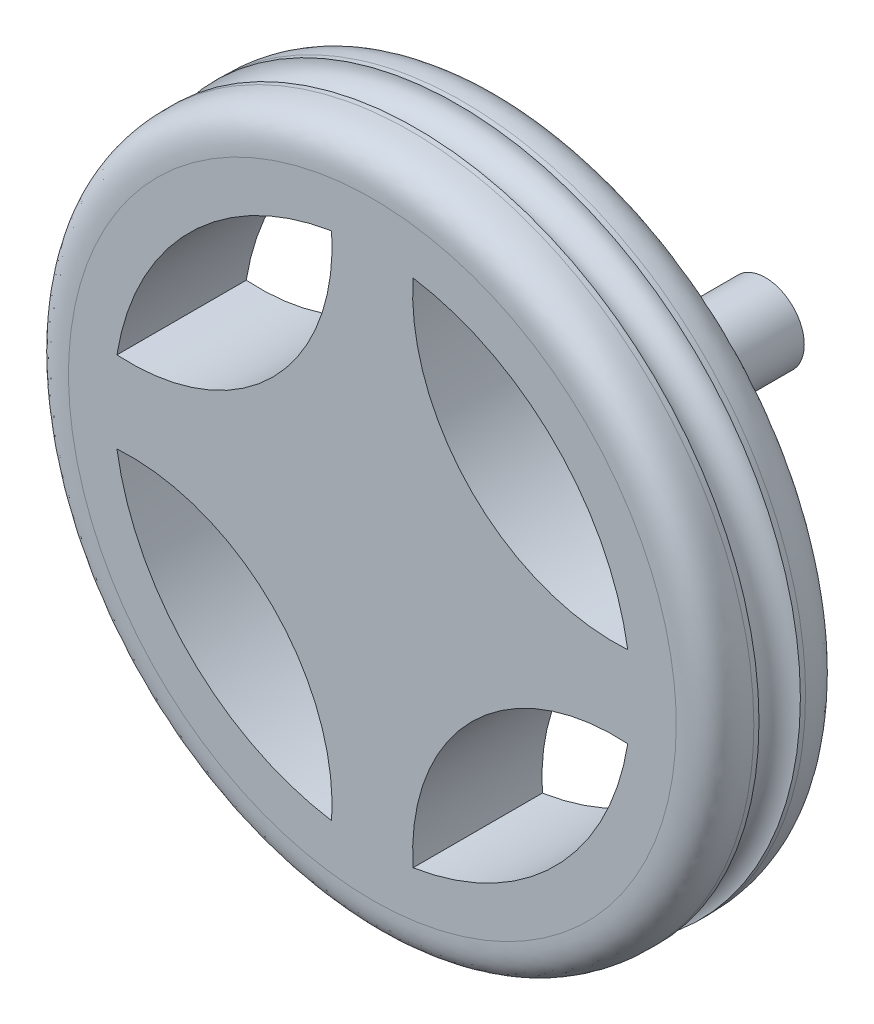
ISO-10303-21;
HEADER;
FILE_DESCRIPTION(('STEP AP214'),'2;1');
FILE_NAME('part.step','',(''),(''),'','','');
FILE_SCHEMA(('AUTOMOTIVE_DESIGN { 1 0 10303 214 1 1 1 1 }'));
ENDSEC;
DATA;
#1=APPLICATION_CONTEXT('core data for automotive mechanical design processes');
#2=APPLICATION_PROTOCOL_DEFINITION('international standard','automotive_design',2000,#1);
#3=PRODUCT_CONTEXT('',#1,'mechanical');
#4=PRODUCT('Part','Part','',(#3));
#5=PRODUCT_RELATED_PRODUCT_CATEGORY('part','',(#4));
#6=PRODUCT_DEFINITION_FORMATION('','',#4);
#7=PRODUCT_DEFINITION_CONTEXT('part definition',#1,'design');
#8=PRODUCT_DEFINITION('design','',#6,#7);
#9=PRODUCT_DEFINITION_SHAPE('','',#8);
#10=(LENGTH_UNIT() NAMED_UNIT(*) SI_UNIT(.MILLI.,.METRE.));
#11=(NAMED_UNIT(*) PLANE_ANGLE_UNIT() SI_UNIT($,.RADIAN.));
#12=(NAMED_UNIT(*) SI_UNIT($,.STERADIAN.) SOLID_ANGLE_UNIT());
#13=UNCERTAINTY_MEASURE_WITH_UNIT(LENGTH_MEASURE(1.E-05),#10,'distance_accuracy_value','');
#14=(GEOMETRIC_REPRESENTATION_CONTEXT(3) GLOBAL_UNCERTAINTY_ASSIGNED_CONTEXT((#13)) GLOBAL_UNIT_ASSIGNED_CONTEXT((#10,
#11,#12)) REPRESENTATION_CONTEXT('',''));
#15=CARTESIAN_POINT('',(0.,0.,0.));
#16=DIRECTION('',(0.,0.,1.));
#17=DIRECTION('',(1.,0.,0.));
#18=AXIS2_PLACEMENT_3D('',#15,#16,#17);
#19=CARTESIAN_POINT('',(4.49639746502567,34.7438056757314,20.));
#20=DIRECTION('',(0.,0.,-1.));
#21=DIRECTION('',(-1.,0.,0.));
#22=AXIS2_PLACEMENT_3D('',#19,#20,#21);
#23=CYLINDRICAL_SURFACE('',#22,26.5);
#24=CARTESIAN_POINT('',(30.9963974650257,34.7438056757314,17.));
#25=CARTESIAN_POINT('',(30.9963974650257,38.2121807728972,17.));
#26=CARTESIAN_POINT('',(29.6165920619499,45.1489309672287,17.));
#27=CARTESIAN_POINT('',(23.7225620450856,53.9699702557912,17.));
#28=CARTESIAN_POINT('',(14.9015227565231,59.8640002726556,17.));
#29=CARTESIAN_POINT('',(4.49639746502556,61.9337083772693,17.));
#30=CARTESIAN_POINT('',(-5.9087278264716,59.8640002726556,17.));
#31=CARTESIAN_POINT('',(-14.7297671150342,53.9699702557913,17.));
#32=CARTESIAN_POINT('',(-20.6237971318985,45.1489309672288,17.));
#33=CARTESIAN_POINT('',(-22.6935052365122,34.7438056757313,17.));
#34=CARTESIAN_POINT('',(-20.6237971318986,24.3386803842342,17.));
#35=CARTESIAN_POINT('',(-14.7297671150342,15.5176410956715,17.));
#36=CARTESIAN_POINT('',(-5.90872782647176,9.62361107880723,17.));
#37=CARTESIAN_POINT('',(4.49639746502572,7.55390297419349,17.));
#38=CARTESIAN_POINT('',(14.901522756523,9.62361107880719,17.));
#39=CARTESIAN_POINT('',(23.7225620450856,15.5176410956715,17.));
#40=CARTESIAN_POINT('',(29.6165920619499,24.3386803842341,17.));
#41=CARTESIAN_POINT('',(30.9963974650257,31.2754305785656,17.));
#42=CARTESIAN_POINT('',(30.9963974650257,34.7438056757314,17.));
#43=B_SPLINE_CURVE_WITH_KNOTS('',3,(#24,#25,#26,#27,#28,#29,#30,#31,#32,#33,#34,#35,#36,#37,#38,
#39,#40,#41,#42),.UNSPECIFIED.,.T.,.F.,(4,1,1,1,1,1,1,1,1,1,1,1,1,1,1,1,4),(-6.28318530717959,
-5.89048622548086,-5.49778714378214,-5.10508806208341,-4.71238898038469,-4.31968989868597,
-3.92699081698724,-3.53429173528852,-3.14159265358979,-2.74889357189107,-2.35619449019235,
-1.96349540849362,-1.5707963267949,-1.17809724509617,-0.785398163397448,-0.392699081698724,0.),.UNSPECIFIED.);
#44=CARTESIAN_POINT('',(30.9963974650257,34.7438056757314,17.));
#45=VERTEX_POINT('',#44);
#46=EDGE_CURVE('E175',#45,#45,#43,.F.);
#47=ORIENTED_EDGE('',*,*,#46,.T.);
#48=EDGE_LOOP('',(#47));
#49=FACE_BOUND('',#48,.T.);
#50=CARTESIAN_POINT('',(4.49639746502567,34.7438056757314,16.6));
#51=DIRECTION('',(0.,0.,-1.));
#52=DIRECTION('',(-1.,0.,0.));
#53=AXIS2_PLACEMENT_3D('',#50,#51,#52);
#54=CIRCLE('',#53,26.5);
#55=CARTESIAN_POINT('',(-22.0036025349743,34.7438056757314,16.6));
#56=VERTEX_POINT('',#55);
#57=EDGE_CURVE('E145',#56,#56,#54,.F.);
#58=ORIENTED_EDGE('',*,*,#57,.T.);
#59=EDGE_LOOP('',(#58));
#60=FACE_BOUND('',#59,.T.);
#61=ADVANCED_FACE('F41',(#49,#60),#23,.T.);
#62=CARTESIAN_POINT('',(30.9963974650257,34.7438056757314,13.));
#63=CARTESIAN_POINT('',(30.9963974650257,31.2754305785656,13.));
#64=CARTESIAN_POINT('',(29.6165920619499,24.3386803842341,13.));
#65=CARTESIAN_POINT('',(23.7225620450856,15.5176410956715,13.));
#66=CARTESIAN_POINT('',(14.901522756523,9.62361107880719,13.));
#67=CARTESIAN_POINT('',(4.49639746502572,7.55390297419349,13.));
#68=CARTESIAN_POINT('',(-5.90872782647176,9.62361107880723,13.));
#69=CARTESIAN_POINT('',(-14.7297671150342,15.5176410956715,13.));
#70=CARTESIAN_POINT('',(-20.6237971318986,24.3386803842342,13.));
#71=CARTESIAN_POINT('',(-22.6935052365122,34.7438056757313,13.));
#72=CARTESIAN_POINT('',(-20.6237971318985,45.1489309672288,13.));
#73=CARTESIAN_POINT('',(-14.7297671150342,53.9699702557913,13.));
#74=CARTESIAN_POINT('',(-5.9087278264716,59.8640002726556,13.));
#75=CARTESIAN_POINT('',(4.49639746502556,61.9337083772693,13.));
#76=CARTESIAN_POINT('',(14.9015227565231,59.8640002726556,13.));
#77=CARTESIAN_POINT('',(23.7225620450856,53.9699702557912,13.));
#78=CARTESIAN_POINT('',(29.6165920619499,45.1489309672287,13.));
#79=CARTESIAN_POINT('',(30.9963974650257,38.2121807728972,13.));
#80=CARTESIAN_POINT('',(30.9963974650257,34.7438056757314,13.));
#81=B_SPLINE_CURVE_WITH_KNOTS('',3,(#62,#63,#64,#65,#66,#67,#68,#69,#70,#71,#72,#73,#74,#75,#76,
#77,#78,#79,#80),.UNSPECIFIED.,.T.,.F.,(4,1,1,1,1,1,1,1,1,1,1,1,1,1,1,1,4),(-6.28318530717959,
-5.89048622548086,-5.49778714378214,-5.10508806208341,-4.71238898038469,-4.31968989868597,
-3.92699081698724,-3.53429173528852,-3.14159265358979,-2.74889357189107,-2.35619449019234,
-1.96349540849362,-1.5707963267949,-1.17809724509617,-0.785398163397448,-0.392699081698724,0.),.UNSPECIFIED.);
#82=CARTESIAN_POINT('',(30.9963974650257,34.7438056757314,13.));
#83=VERTEX_POINT('',#82);
#84=EDGE_CURVE('E53',#83,#83,#81,.F.);
#85=ORIENTED_EDGE('',*,*,#84,.T.);
#86=EDGE_LOOP('',(#85));
#87=FACE_BOUND('',#86,.T.);
#88=CARTESIAN_POINT('',(4.49639746502567,34.7438056757314,13.4));
#89=DIRECTION('',(0.,0.,1.));
#90=DIRECTION('',(1.,0.,0.));
#91=AXIS2_PLACEMENT_3D('',#88,#89,#90);
#92=CIRCLE('',#91,26.5);
#93=CARTESIAN_POINT('',(30.9963974650257,34.7438056757314,13.4));
#94=VERTEX_POINT('',#93);
#95=EDGE_CURVE('E176',#94,#94,#92,.F.);
#96=ORIENTED_EDGE('',*,*,#95,.T.);
#97=EDGE_LOOP('',(#96));
#98=FACE_BOUND('',#97,.T.);
#99=ADVANCED_FACE('F199',(#87,#98),#23,.T.);
#100=CARTESIAN_POINT('',(23.2347271664692,16.0054759742879,20.));
#101=DIRECTION('',(0.,0.,-1.));
#102=DIRECTION('',(-1.,0.,0.));
#103=AXIS2_PLACEMENT_3D('',#100,#101,#102);
#104=CYLINDRICAL_SURFACE('',#103,15.6240206666318);
#105=CARTESIAN_POINT('',(23.2347271664692,16.0054759742879,10.));
#106=DIRECTION('',(0.,0.,1.));
#107=DIRECTION('',(1.,0.,0.));
#108=AXIS2_PLACEMENT_3D('',#105,#106,#107);
#109=CIRCLE('',#108,15.6240206666318);
#110=CARTESIAN_POINT('',(7.64354834771268,14.9929717358289,10.));
#111=VERTEX_POINT('',#110);
#112=CARTESIAN_POINT('',(24.2472314049281,31.5966547930444,10.));
#113=VERTEX_POINT('',#112);
#114=EDGE_CURVE('E140',#111,#113,#109,.F.);
#115=ORIENTED_EDGE('',*,*,#114,.T.);
#116=DIRECTION('',(0.,0.,-1.));
#117=VECTOR('',#116,1.);
#118=CARTESIAN_POINT('',(24.2472314049281,31.5966547930444,20.));
#119=LINE('',#118,#117);
#120=CARTESIAN_POINT('',(24.2472314049281,31.5966547930444,20.));
#121=VERTEX_POINT('',#120);
#122=EDGE_CURVE('E170',#121,#113,#119,.T.);
#123=ORIENTED_EDGE('',*,*,#122,.F.);
#124=CARTESIAN_POINT('',(23.2347271664692,16.0054759742879,20.));
#125=DIRECTION('',(0.,0.,1.));
#126=DIRECTION('',(1.,0.,0.));
#127=AXIS2_PLACEMENT_3D('',#124,#125,#126);
#128=CIRCLE('',#127,15.6240206666318);
#129=CARTESIAN_POINT('',(7.64354834771268,14.9929717358289,20.));
#130=VERTEX_POINT('',#129);
#131=EDGE_CURVE('E95',#130,#121,#128,.F.);
#132=ORIENTED_EDGE('',*,*,#131,.F.);
#133=DIRECTION('',(0.,0.,-1.));
#134=VECTOR('',#133,1.);
#135=CARTESIAN_POINT('',(7.64354834771268,14.9929717358289,20.));
#136=LINE('',#135,#134);
#137=EDGE_CURVE('E173',#130,#111,#136,.T.);
#138=ORIENTED_EDGE('',*,*,#137,.T.);
#139=EDGE_LOOP('',(#115,#123,#132,#138));
#140=FACE_BOUND('',#139,.T.);
#141=ADVANCED_FACE('F239',(#140),#104,.F.);
#142=CARTESIAN_POINT('',(23.2347271664692,53.4821353771749,20.));
#143=DIRECTION('',(0.,0.,-1.));
#144=DIRECTION('',(-1.,0.,0.));
#145=AXIS2_PLACEMENT_3D('',#142,#143,#144);
#146=CYLINDRICAL_SURFACE('',#145,15.6240206666318);
#147=CARTESIAN_POINT('',(23.2347271664692,53.4821353771749,10.));
#148=DIRECTION('',(0.,0.,1.));
#149=DIRECTION('',(1.,0.,0.));
#150=AXIS2_PLACEMENT_3D('',#147,#148,#149);
#151=CIRCLE('',#150,15.6240206666318);
#152=CARTESIAN_POINT('',(7.64354834771268,54.4946396156338,10.));
#153=VERTEX_POINT('',#152);
#154=CARTESIAN_POINT('',(24.2472314049281,37.8909565584184,10.));
#155=VERTEX_POINT('',#154);
#156=EDGE_CURVE('E156',#153,#155,#151,.T.);
#157=ORIENTED_EDGE('',*,*,#156,.F.);
#158=DIRECTION('',(0.,0.,-1.));
#159=VECTOR('',#158,1.);
#160=CARTESIAN_POINT('',(7.64354834771268,54.4946396156338,20.));
#161=LINE('',#160,#159);
#162=CARTESIAN_POINT('',(7.64354834771268,54.4946396156338,20.));
#163=VERTEX_POINT('',#162);
#164=EDGE_CURVE('E164',#163,#153,#161,.T.);
#165=ORIENTED_EDGE('',*,*,#164,.F.);
#166=CARTESIAN_POINT('',(23.2347271664692,53.4821353771749,20.));
#167=DIRECTION('',(0.,0.,1.));
#168=DIRECTION('',(1.,0.,0.));
#169=AXIS2_PLACEMENT_3D('',#166,#167,#168);
#170=CIRCLE('',#169,15.6240206666318);
#171=CARTESIAN_POINT('',(24.2472314049281,37.8909565584184,20.));
#172=VERTEX_POINT('',#171);
#173=EDGE_CURVE('E122',#163,#172,#170,.T.);
#174=ORIENTED_EDGE('',*,*,#173,.T.);
#175=DIRECTION('',(0.,0.,-1.));
#176=VECTOR('',#175,1.);
#177=CARTESIAN_POINT('',(24.2472314049281,37.8909565584184,20.));
#178=LINE('',#177,#176);
#179=EDGE_CURVE('E167',#172,#155,#178,.T.);
#180=ORIENTED_EDGE('',*,*,#179,.T.);
#181=EDGE_LOOP('',(#157,#165,#174,#180));
#182=FACE_BOUND('',#181,.T.);
#183=ADVANCED_FACE('F370',(#182),#146,.F.);
#184=CARTESIAN_POINT('',(-14.2419322364178,53.4821353771749,20.));
#185=DIRECTION('',(0.,0.,-1.));
#186=DIRECTION('',(-1.,0.,0.));
#187=AXIS2_PLACEMENT_3D('',#184,#185,#186);
#188=CYLINDRICAL_SURFACE('',#187,15.6240206666318);
#189=CARTESIAN_POINT('',(-14.2419322364178,53.4821353771749,10.));
#190=DIRECTION('',(0.,0.,1.));
#191=DIRECTION('',(1.,0.,0.));
#192=AXIS2_PLACEMENT_3D('',#189,#190,#191);
#193=CIRCLE('',#192,15.6240206666318);
#194=CARTESIAN_POINT('',(1.34924658233867,54.4946396156338,10.));
#195=VERTEX_POINT('',#194);
#196=CARTESIAN_POINT('',(-15.2544364748768,37.8909565584184,10.));
#197=VERTEX_POINT('',#196);
#198=EDGE_CURVE('E128',#195,#197,#193,.F.);
#199=ORIENTED_EDGE('',*,*,#198,.T.);
#200=DIRECTION('',(0.,0.,-1.));
#201=VECTOR('',#200,1.);
#202=CARTESIAN_POINT('',(-15.2544364748768,37.8909565584184,20.));
#203=LINE('',#202,#201);
#204=CARTESIAN_POINT('',(-15.2544364748768,37.8909565584184,20.));
#205=VERTEX_POINT('',#204);
#206=EDGE_CURVE('E125',#205,#197,#203,.T.);
#207=ORIENTED_EDGE('',*,*,#206,.F.);
#208=CARTESIAN_POINT('',(-14.2419322364178,53.4821353771749,20.));
#209=DIRECTION('',(0.,0.,1.));
#210=DIRECTION('',(1.,0.,0.));
#211=AXIS2_PLACEMENT_3D('',#208,#209,#210);
#212=CIRCLE('',#211,15.6240206666318);
#213=CARTESIAN_POINT('',(1.34924658233867,54.4946396156338,20.));
#214=VERTEX_POINT('',#213);
#215=EDGE_CURVE('E112',#214,#205,#212,.F.);
#216=ORIENTED_EDGE('',*,*,#215,.F.);
#217=DIRECTION('',(0.,0.,-1.));
#218=VECTOR('',#217,1.);
#219=CARTESIAN_POINT('',(1.34924658233867,54.4946396156338,20.));
#220=LINE('',#219,#218);
#221=EDGE_CURVE('E132',#214,#195,#220,.T.);
#222=ORIENTED_EDGE('',*,*,#221,.T.);
#223=EDGE_LOOP('',(#199,#207,#216,#222));
#224=FACE_BOUND('',#223,.T.);
#225=ADVANCED_FACE('F126',(#224),#188,.F.);
#226=CARTESIAN_POINT('',(-14.2419322364178,16.0054759742879,20.));
#227=DIRECTION('',(0.,0.,-1.));
#228=DIRECTION('',(-1.,0.,0.));
#229=AXIS2_PLACEMENT_3D('',#226,#227,#228);
#230=CYLINDRICAL_SURFACE('',#229,15.6240206666318);
#231=CARTESIAN_POINT('',(-14.2419322364178,16.0054759742879,10.));
#232=DIRECTION('',(0.,0.,1.));
#233=DIRECTION('',(1.,0.,0.));
#234=AXIS2_PLACEMENT_3D('',#231,#232,#233);
#235=CIRCLE('',#234,15.6240206666318);
#236=CARTESIAN_POINT('',(1.34924658233867,14.9929717358289,10.));
#237=VERTEX_POINT('',#236);
#238=CARTESIAN_POINT('',(-15.2544364748768,31.5966547930444,10.));
#239=VERTEX_POINT('',#238);
#240=EDGE_CURVE('E87',#237,#239,#235,.T.);
#241=ORIENTED_EDGE('',*,*,#240,.F.);
#242=DIRECTION('',(0.,0.,-1.));
#243=VECTOR('',#242,1.);
#244=CARTESIAN_POINT('',(1.34924658233867,14.9929717358289,20.));
#245=LINE('',#244,#243);
#246=CARTESIAN_POINT('',(1.34924658233867,14.9929717358289,20.));
#247=VERTEX_POINT('',#246);
#248=EDGE_CURVE('E68',#247,#237,#245,.T.);
#249=ORIENTED_EDGE('',*,*,#248,.F.);
#250=CARTESIAN_POINT('',(-14.2419322364178,16.0054759742879,20.));
#251=DIRECTION('',(0.,0.,1.));
#252=DIRECTION('',(1.,0.,0.));
#253=AXIS2_PLACEMENT_3D('',#250,#251,#252);
#254=CIRCLE('',#253,15.6240206666318);
#255=CARTESIAN_POINT('',(-15.2544364748768,31.5966547930444,20.));
#256=VERTEX_POINT('',#255);
#257=EDGE_CURVE('E121',#247,#256,#254,.T.);
#258=ORIENTED_EDGE('',*,*,#257,.T.);
#259=DIRECTION('',(0.,0.,-1.));
#260=VECTOR('',#259,1.);
#261=CARTESIAN_POINT('',(-15.2544364748768,31.5966547930444,20.));
#262=LINE('',#261,#260);
#263=EDGE_CURVE('E133',#256,#239,#262,.T.);
#264=ORIENTED_EDGE('',*,*,#263,.T.);
#265=EDGE_LOOP('',(#241,#249,#258,#264));
#266=FACE_BOUND('',#265,.T.);
#267=ADVANCED_FACE('F285',(#266),#230,.F.);
#268=CARTESIAN_POINT('',(0.,0.,20.));
#269=DIRECTION('',(0.,0.,1.));
#270=DIRECTION('',(1.,0.,0.));
#271=AXIS2_PLACEMENT_3D('',#268,#269,#270);
#272=PLANE('',#271);
#273=CARTESIAN_POINT('',(27.9963974650257,34.7438056757314,20.));
#274=CARTESIAN_POINT('',(27.9963974650257,31.6680768159806,20.));
#275=CARTESIAN_POINT('',(26.7727964472037,25.516619096479,20.));
#276=CARTESIAN_POINT('',(21.5460151114939,17.6941880292632,20.));
#277=CARTESIAN_POINT('',(13.723584044278,12.4674066935533,20.));
#278=CARTESIAN_POINT('',(4.49639746502572,10.6320051668204,20.));
#279=CARTESIAN_POINT('',(-4.73078911422677,12.4674066935534,20.));
#280=CARTESIAN_POINT('',(-12.5532201814425,17.6941880292631,20.));
#281=CARTESIAN_POINT('',(-17.7800015171524,25.5166190964791,20.));
#282=CARTESIAN_POINT('',(-19.6154030438853,34.7438056757313,20.));
#283=CARTESIAN_POINT('',(-17.7800015171524,43.9709922549838,20.));
#284=CARTESIAN_POINT('',(-12.5532201814425,51.7934233221996,20.));
#285=CARTESIAN_POINT('',(-4.73078911422662,57.0202046579095,20.));
#286=CARTESIAN_POINT('',(4.49639746502558,58.8556061846424,20.));
#287=CARTESIAN_POINT('',(13.7235840442781,57.0202046579095,20.));
#288=CARTESIAN_POINT('',(21.5460151114939,51.7934233221996,20.));
#289=CARTESIAN_POINT('',(26.7727964472038,43.9709922549837,20.));
#290=CARTESIAN_POINT('',(27.9963974650257,37.8195345354822,20.));
#291=CARTESIAN_POINT('',(27.9963974650257,34.7438056757314,20.));
#292=B_SPLINE_CURVE_WITH_KNOTS('',3,(#273,#274,#275,#276,#277,#278,#279,#280,#281,#282,#283,
#284,#285,#286,#287,#288,#289,#290,#291),.UNSPECIFIED.,.T.,.F.,(4,1,1,1,1,1,1,1,1,1,1,1,1,1,1,1,
4),(-6.28318530717959,-5.89048622548086,-5.49778714378214,-5.10508806208341,-4.71238898038469,
-4.31968989868597,-3.92699081698724,-3.53429173528852,-3.14159265358979,-2.74889357189107,
-2.35619449019234,-1.96349540849362,-1.5707963267949,-1.17809724509617,-0.785398163397448,
-0.392699081698724,0.),.UNSPECIFIED.);
#293=CARTESIAN_POINT('',(27.9963974650257,34.7438056757314,20.));
#294=VERTEX_POINT('',#293);
#295=EDGE_CURVE('E278',#294,#294,#292,.F.);
#296=ORIENTED_EDGE('',*,*,#295,.T.);
#297=EDGE_LOOP('',(#296));
#298=FACE_BOUND('',#297,.T.);
#299=CARTESIAN_POINT('',(4.49639746502567,34.7438056757314,20.));
#300=DIRECTION('',(0.,0.,1.));
#301=DIRECTION('',(1.,0.,0.));
#302=AXIS2_PLACEMENT_3D('',#299,#300,#301);
#303=CIRCLE('',#302,20.);
#304=EDGE_CURVE('E141',#130,#121,#303,.T.);
#305=ORIENTED_EDGE('',*,*,#304,.F.);
#306=ORIENTED_EDGE('',*,*,#131,.T.);
#307=EDGE_LOOP('',(#305,#306));
#308=FACE_BOUND('',#307,.T.);
#309=EDGE_CURVE('E137',#256,#247,#303,.T.);
#310=ORIENTED_EDGE('',*,*,#309,.F.);
#311=ORIENTED_EDGE('',*,*,#257,.F.);
#312=EDGE_LOOP('',(#310,#311));
#313=FACE_BOUND('',#312,.T.);
#314=EDGE_CURVE('E117',#214,#205,#303,.T.);
#315=ORIENTED_EDGE('',*,*,#314,.F.);
#316=ORIENTED_EDGE('',*,*,#215,.T.);
#317=EDGE_LOOP('',(#315,#316));
#318=FACE_BOUND('',#317,.T.);
#319=ORIENTED_EDGE('',*,*,#173,.F.);
#320=EDGE_CURVE('E136',#172,#163,#303,.T.);
#321=ORIENTED_EDGE('',*,*,#320,.F.);
#322=EDGE_LOOP('',(#319,#321));
#323=FACE_BOUND('',#322,.T.);
#324=ADVANCED_FACE('F114',(#298,#308,#313,#318,#323),#272,.T.);
#325=CARTESIAN_POINT('',(0.,0.,10.));
#326=DIRECTION('',(0.,0.,1.));
#327=DIRECTION('',(1.,0.,0.));
#328=AXIS2_PLACEMENT_3D('',#325,#326,#327);
#329=PLANE('',#328);
#330=CARTESIAN_POINT('',(4.49639746502568,34.7438056757314,10.));
#331=DIRECTION('',(0.,0.,1.));
#332=DIRECTION('',(1.,0.,0.));
#333=AXIS2_PLACEMENT_3D('',#330,#331,#332);
#334=CIRCLE('',#333,3.);
#335=CARTESIAN_POINT('',(7.49639746502568,34.7438056757314,10.));
#336=VERTEX_POINT('',#335);
#337=EDGE_CURVE('E11',#336,#336,#334,.F.);
#338=ORIENTED_EDGE('',*,*,#337,.F.);
#339=EDGE_LOOP('',(#338));
#340=FACE_BOUND('',#339,.T.);
#341=CARTESIAN_POINT('',(27.9963974650257,34.7438056757314,10.));
#342=CARTESIAN_POINT('',(27.9963974650257,37.8195345354822,10.));
#343=CARTESIAN_POINT('',(26.7727964472038,43.9709922549837,10.));
#344=CARTESIAN_POINT('',(21.5460151114939,51.7934233221996,10.));
#345=CARTESIAN_POINT('',(13.7235840442781,57.0202046579095,10.));
#346=CARTESIAN_POINT('',(4.49639746502558,58.8556061846424,10.));
#347=CARTESIAN_POINT('',(-4.73078911422663,57.0202046579095,10.));
#348=CARTESIAN_POINT('',(-12.5532201814425,51.7934233221996,10.));
#349=CARTESIAN_POINT('',(-17.7800015171524,43.9709922549838,10.));
#350=CARTESIAN_POINT('',(-19.6154030438853,34.7438056757313,10.));
#351=CARTESIAN_POINT('',(-17.7800015171525,25.5166190964791,10.));
#352=CARTESIAN_POINT('',(-12.5532201814425,17.6941880292631,10.));
#353=CARTESIAN_POINT('',(-4.73078911422678,12.4674066935534,10.));
#354=CARTESIAN_POINT('',(4.49639746502572,10.6320051668204,10.));
#355=CARTESIAN_POINT('',(13.723584044278,12.4674066935533,10.));
#356=CARTESIAN_POINT('',(21.5460151114939,17.6941880292632,10.));
#357=CARTESIAN_POINT('',(26.7727964472037,25.516619096479,10.));
#358=CARTESIAN_POINT('',(27.9963974650257,31.6680768159806,10.));
#359=CARTESIAN_POINT('',(27.9963974650257,34.7438056757314,10.));
#360=B_SPLINE_CURVE_WITH_KNOTS('',3,(#341,#342,#343,#344,#345,#346,#347,#348,#349,#350,#351,
#352,#353,#354,#355,#356,#357,#358,#359),.UNSPECIFIED.,.T.,.F.,(4,1,1,1,1,1,1,1,1,1,1,1,1,1,1,1,
4),(-6.28318530717959,-5.89048622548086,-5.49778714378214,-5.10508806208341,-4.71238898038469,
-4.31968989868597,-3.92699081698724,-3.53429173528852,-3.14159265358979,-2.74889357189107,
-2.35619449019235,-1.96349540849362,-1.5707963267949,-1.17809724509617,-0.785398163397448,
-0.392699081698724,0.),.UNSPECIFIED.);
#361=CARTESIAN_POINT('',(27.9963974650257,34.7438056757314,10.));
#362=VERTEX_POINT('',#361);
#363=EDGE_CURVE('E259',#362,#362,#360,.F.);
#364=ORIENTED_EDGE('',*,*,#363,.T.);
#365=EDGE_LOOP('',(#364));
#366=FACE_BOUND('',#365,.T.);
#367=ORIENTED_EDGE('',*,*,#114,.F.);
#368=CARTESIAN_POINT('',(4.49639746502567,34.7438056757314,10.));
#369=DIRECTION('',(0.,0.,1.));
#370=DIRECTION('',(1.,0.,0.));
#371=AXIS2_PLACEMENT_3D('',#368,#369,#370);
#372=CIRCLE('',#371,20.);
#373=EDGE_CURVE('E151',#111,#113,#372,.T.);
#374=ORIENTED_EDGE('',*,*,#373,.T.);
#375=EDGE_LOOP('',(#367,#374));
#376=FACE_BOUND('',#375,.T.);
#377=ORIENTED_EDGE('',*,*,#240,.T.);
#378=EDGE_CURVE('E295',#239,#237,#372,.T.);
#379=ORIENTED_EDGE('',*,*,#378,.T.);
#380=EDGE_LOOP('',(#377,#379));
#381=FACE_BOUND('',#380,.T.);
#382=ORIENTED_EDGE('',*,*,#198,.F.);
#383=EDGE_CURVE('E150',#195,#197,#372,.T.);
#384=ORIENTED_EDGE('',*,*,#383,.T.);
#385=EDGE_LOOP('',(#382,#384));
#386=FACE_BOUND('',#385,.T.);
#387=EDGE_CURVE('E147',#155,#153,#372,.T.);
#388=ORIENTED_EDGE('',*,*,#387,.T.);
#389=ORIENTED_EDGE('',*,*,#156,.T.);
#390=EDGE_LOOP('',(#388,#389));
#391=FACE_BOUND('',#390,.T.);
#392=ADVANCED_FACE('F284',(#340,#366,#376,#381,#386,#391),#329,.F.);
#393=CARTESIAN_POINT('',(4.49639746502567,34.7438056757314,20.));
#394=DIRECTION('',(0.,0.,-1.));
#395=DIRECTION('',(-1.,0.,0.));
#396=AXIS2_PLACEMENT_3D('',#393,#394,#395);
#397=CYLINDRICAL_SURFACE('',#396,20.);
#398=ORIENTED_EDGE('',*,*,#122,.T.);
#399=ORIENTED_EDGE('',*,*,#373,.F.);
#400=ORIENTED_EDGE('',*,*,#137,.F.);
#401=ORIENTED_EDGE('',*,*,#304,.T.);
#402=EDGE_LOOP('',(#398,#399,#400,#401));
#403=FACE_BOUND('',#402,.T.);
#404=ADVANCED_FACE('F355',(#403),#397,.F.);
#405=ORIENTED_EDGE('',*,*,#206,.T.);
#406=ORIENTED_EDGE('',*,*,#383,.F.);
#407=ORIENTED_EDGE('',*,*,#221,.F.);
#408=ORIENTED_EDGE('',*,*,#314,.T.);
#409=EDGE_LOOP('',(#405,#406,#407,#408));
#410=FACE_BOUND('',#409,.T.);
#411=ADVANCED_FACE('F135',(#410),#397,.F.);
#412=ORIENTED_EDGE('',*,*,#320,.T.);
#413=ORIENTED_EDGE('',*,*,#164,.T.);
#414=ORIENTED_EDGE('',*,*,#387,.F.);
#415=ORIENTED_EDGE('',*,*,#179,.F.);
#416=EDGE_LOOP('',(#412,#413,#414,#415));
#417=FACE_BOUND('',#416,.T.);
#418=ADVANCED_FACE('F366',(#417),#397,.F.);
#419=ORIENTED_EDGE('',*,*,#309,.T.);
#420=ORIENTED_EDGE('',*,*,#248,.T.);
#421=ORIENTED_EDGE('',*,*,#378,.F.);
#422=ORIENTED_EDGE('',*,*,#263,.F.);
#423=EDGE_LOOP('',(#419,#420,#421,#422));
#424=FACE_BOUND('',#423,.T.);
#425=ADVANCED_FACE('F202',(#424),#397,.F.);
#426=CARTESIAN_POINT('',(4.49639746502567,34.7438056757314,15.));
#427=DIRECTION('',(0.,0.,-1.));
#428=DIRECTION('',(-1.,0.,0.));
#429=AXIS2_PLACEMENT_3D('',#426,#427,#428);
#430=TOROIDAL_SURFACE('',#429,26.4999999936344,1.6);
#431=ORIENTED_EDGE('',*,*,#57,.F.);
#432=EDGE_LOOP('',(#431));
#433=FACE_BOUND('',#432,.T.);
#434=ORIENTED_EDGE('',*,*,#95,.F.);
#435=EDGE_LOOP('',(#434));
#436=FACE_BOUND('',#435,.T.);
#437=ADVANCED_FACE('F200',(#433,#436),#430,.F.);
#438=CARTESIAN_POINT('',(27.9963974650257,34.7438056757314,20.));
#439=CARTESIAN_POINT('',(27.9963974650257,37.8195345354822,20.));
#440=CARTESIAN_POINT('',(26.7727964472038,43.9709922549837,20.));
#441=CARTESIAN_POINT('',(21.5460151114939,51.7934233221996,20.));
#442=CARTESIAN_POINT('',(13.7235840442781,57.0202046579095,20.));
#443=CARTESIAN_POINT('',(4.49639746502558,58.8556061846424,20.));
#444=CARTESIAN_POINT('',(-4.73078911422662,57.0202046579095,20.));
#445=CARTESIAN_POINT('',(-12.5532201814425,51.7934233221996,20.));
#446=CARTESIAN_POINT('',(-17.7800015171524,43.9709922549838,20.));
#447=CARTESIAN_POINT('',(-19.6154030438853,34.7438056757313,20.));
#448=CARTESIAN_POINT('',(-17.7800015171524,25.5166190964791,20.));
#449=CARTESIAN_POINT('',(-12.5532201814425,17.6941880292631,20.));
#450=CARTESIAN_POINT('',(-4.73078911422677,12.4674066935534,20.));
#451=CARTESIAN_POINT('',(4.49639746502572,10.6320051668204,20.));
#452=CARTESIAN_POINT('',(13.723584044278,12.4674066935533,20.));
#453=CARTESIAN_POINT('',(21.5460151114939,17.6941880292632,20.));
#454=CARTESIAN_POINT('',(26.7727964472037,25.516619096479,20.));
#455=CARTESIAN_POINT('',(27.9963974650257,31.6680768159806,20.));
#456=CARTESIAN_POINT('',(27.9963974650257,34.7438056757314,20.));
#457=CARTESIAN_POINT('',(28.5009916196275,34.7438056757314,20.));
#458=CARTESIAN_POINT('',(28.5009916196275,37.8855768675575,20.));
#459=CARTESIAN_POINT('',(27.2511173285648,44.1691192512097,20.));
#460=CARTESIAN_POINT('',(21.9121060647962,52.1595142755019,20.));
#461=CARTESIAN_POINT('',(13.9217110405041,57.4985255392705,20.));
#462=CARTESIAN_POINT('',(4.49639746502557,59.3733369758646,20.));
#463=CARTESIAN_POINT('',(-4.92891611045264,57.4985255392706,20.));
#464=CARTESIAN_POINT('',(-12.9193111347448,52.159514275502,20.));
#465=CARTESIAN_POINT('',(-18.2583223985135,44.1691192512098,20.));
#466=CARTESIAN_POINT('',(-20.1331338351075,34.7438056757313,20.));
#467=CARTESIAN_POINT('',(-18.2583223985135,25.3184921002531,20.));
#468=CARTESIAN_POINT('',(-12.9193111347448,17.3280970759608,20.));
#469=CARTESIAN_POINT('',(-4.92891611045279,11.9890858121923,20.));
#470=CARTESIAN_POINT('',(4.49639746502572,10.1142743755982,20.));
#471=CARTESIAN_POINT('',(13.921711040504,11.9890858121922,20.));
#472=CARTESIAN_POINT('',(21.9121060647962,17.3280970759609,20.));
#473=CARTESIAN_POINT('',(27.2511173285648,25.318492100253,20.));
#474=CARTESIAN_POINT('',(28.5009916196275,31.6020344839053,20.));
#475=CARTESIAN_POINT('',(28.5009916196275,34.7438056757314,20.));
#476=CARTESIAN_POINT('',(29.0055857742294,34.7438056757314,20.));
#477=CARTESIAN_POINT('',(29.0055857742294,37.9516191996329,20.));
#478=CARTESIAN_POINT('',(27.7294382099259,44.3672462474357,20.));
#479=CARTESIAN_POINT('',(22.2781970180985,52.5256052288042,20.));
#480=CARTESIAN_POINT('',(14.1198380367301,57.9768464206316,20.));
#481=CARTESIAN_POINT('',(4.49639746502557,59.8910677670868,20.));
#482=CARTESIAN_POINT('',(-5.12704310667865,57.9768464206317,20.));
#483=CARTESIAN_POINT('',(-13.2854020880471,52.5256052288043,20.));
#484=CARTESIAN_POINT('',(-18.7366432798746,44.3672462474359,20.));
#485=CARTESIAN_POINT('',(-20.6508646263297,34.7438056757313,20.));
#486=CARTESIAN_POINT('',(-18.7366432798746,25.1203651040271,20.));
#487=CARTESIAN_POINT('',(-13.2854020880471,16.9620061226585,20.));
#488=CARTESIAN_POINT('',(-5.1270431066788,11.5107649308312,20.));
#489=CARTESIAN_POINT('',(4.49639746502572,9.59654358437599,20.));
#490=CARTESIAN_POINT('',(14.1198380367301,11.5107649308312,20.));
#491=CARTESIAN_POINT('',(22.2781970180985,16.9620061226586,20.));
#492=CARTESIAN_POINT('',(27.7294382099259,25.120365104027,20.));
#493=CARTESIAN_POINT('',(29.0055857742294,31.53599215183,20.));
#494=CARTESIAN_POINT('',(29.0055857742294,34.7438056757314,20.));
#495=CARTESIAN_POINT('',(30.1177178085853,34.7438056757314,19.7849242404918));
#496=CARTESIAN_POINT('',(30.1177178085853,38.0971773525657,19.7849242404918));
#497=CARTESIAN_POINT('',(28.7836636106993,44.8039207062343,19.7849242404918));
#498=CARTESIAN_POINT('',(23.0850662078074,53.332474418513,19.7849242404918));
#499=CARTESIAN_POINT('',(14.5565124955287,59.031071821405,19.7849242404917));
#500=CARTESIAN_POINT('',(4.49639746502557,61.032153118234,19.7849242404918));
#501=CARTESIAN_POINT('',(-5.56371756547719,59.0310718214051,19.7849242404918));
#502=CARTESIAN_POINT('',(-14.092271277756,53.3324744185131,19.7849242404918));
#503=CARTESIAN_POINT('',(-19.790868680648,44.8039207062344,19.7849242404918));
#504=CARTESIAN_POINT('',(-21.791949977477,34.7438056757313,19.7849242404917));
#505=CARTESIAN_POINT('',(-19.790868680648,24.6836906452286,19.7849242404918));
#506=CARTESIAN_POINT('',(-14.0922712777559,16.1551369329497,19.7849242404917));
#507=CARTESIAN_POINT('',(-5.56371756547736,10.4565395300578,19.7849242404918));
#508=CARTESIAN_POINT('',(4.49639746502572,8.45545823322874,19.7849242404918));
#509=CARTESIAN_POINT('',(14.5565124955286,10.4565395300578,19.7849242404918));
#510=CARTESIAN_POINT('',(23.0850662078074,16.1551369329498,19.7849242404918));
#511=CARTESIAN_POINT('',(28.7836636106993,24.6836906452285,19.7849242404918));
#512=CARTESIAN_POINT('',(30.1177178085853,31.3904339988971,19.7849242404918));
#513=CARTESIAN_POINT('',(30.1177178085853,34.7438056757314,19.7849242404918));
#514=CARTESIAN_POINT('',(30.7813217055174,34.7438056757314,19.1213203435596));
#515=CARTESIAN_POINT('',(30.7813217055174,38.1840312103205,19.1213203435596));
#516=CARTESIAN_POINT('',(29.4127148947073,45.0644822794986,19.1213203435596));
#517=CARTESIAN_POINT('',(23.5665212168031,53.8139294275087,19.1213203435596));
#518=CARTESIAN_POINT('',(14.817074068793,59.660123105413,19.1213203435596));
#519=CARTESIAN_POINT('',(4.49639746502557,61.7130333216282,19.1213203435596));
#520=CARTESIAN_POINT('',(-5.82427913874152,59.6601231054131,19.1213203435596));
#521=CARTESIAN_POINT('',(-14.5737262867516,53.8139294275088,19.1213203435596));
#522=CARTESIAN_POINT('',(-20.4199199646559,45.0644822794987,19.1213203435596));
#523=CARTESIAN_POINT('',(-22.4728301808711,34.7438056757313,19.1213203435596));
#524=CARTESIAN_POINT('',(-20.419919964656,24.4231290719642,19.1213203435597));
#525=CARTESIAN_POINT('',(-14.5737262867516,15.673681923954,19.1213203435596));
#526=CARTESIAN_POINT('',(-5.82427913874168,9.82748824604982,19.1213203435596));
#527=CARTESIAN_POINT('',(4.49639746502572,7.77457802983457,19.1213203435596));
#528=CARTESIAN_POINT('',(14.8170740687929,9.82748824604978,19.1213203435596));
#529=CARTESIAN_POINT('',(23.5665212168031,15.6736819239541,19.1213203435596));
#530=CARTESIAN_POINT('',(29.4127148947073,24.4231290719641,19.1213203435596));
#531=CARTESIAN_POINT('',(30.7813217055174,31.3035801411423,19.1213203435596));
#532=CARTESIAN_POINT('',(30.7813217055174,34.7438056757314,19.1213203435596));
#533=CARTESIAN_POINT('',(30.9963974650257,34.7438056757314,18.0091883092037));
#534=CARTESIAN_POINT('',(30.9963974650257,38.2121807728972,18.0091883092037));
#535=CARTESIAN_POINT('',(29.6165920619499,45.1489309672287,18.0091883092037));
#536=CARTESIAN_POINT('',(23.7225620450856,53.9699702557912,18.0091883092037));
#537=CARTESIAN_POINT('',(14.9015227565231,59.8640002726556,18.0091883092037));
#538=CARTESIAN_POINT('',(4.49639746502556,61.9337083772693,18.0091883092037));
#539=CARTESIAN_POINT('',(-5.9087278264716,59.8640002726556,18.0091883092037));
#540=CARTESIAN_POINT('',(-14.7297671150342,53.9699702557913,18.0091883092037));
#541=CARTESIAN_POINT('',(-20.6237971318985,45.1489309672288,18.0091883092037));
#542=CARTESIAN_POINT('',(-22.6935052365122,34.7438056757313,18.0091883092037));
#543=CARTESIAN_POINT('',(-20.6237971318986,24.3386803842342,18.0091883092037));
#544=CARTESIAN_POINT('',(-14.7297671150342,15.5176410956715,18.0091883092037));
#545=CARTESIAN_POINT('',(-5.90872782647176,9.62361107880723,18.0091883092037));
#546=CARTESIAN_POINT('',(4.49639746502572,7.55390297419349,18.0091883092037));
#547=CARTESIAN_POINT('',(14.901522756523,9.62361107880719,18.0091883092037));
#548=CARTESIAN_POINT('',(23.7225620450856,15.5176410956715,18.0091883092037));
#549=CARTESIAN_POINT('',(29.6165920619499,24.3386803842341,18.0091883092037));
#550=CARTESIAN_POINT('',(30.9963974650257,31.2754305785656,18.0091883092037));
#551=CARTESIAN_POINT('',(30.9963974650257,34.7438056757314,18.0091883092037));
#552=CARTESIAN_POINT('',(30.9963974650257,34.7438056757314,17.5045941546018));
#553=CARTESIAN_POINT('',(30.9963974650257,38.2121807728972,17.5045941546018));
#554=CARTESIAN_POINT('',(29.6165920619499,45.1489309672287,17.5045941546018));
#555=CARTESIAN_POINT('',(23.7225620450856,53.9699702557912,17.5045941546018));
#556=CARTESIAN_POINT('',(14.9015227565231,59.8640002726556,17.5045941546018));
#557=CARTESIAN_POINT('',(4.49639746502556,61.9337083772693,17.5045941546018));
#558=CARTESIAN_POINT('',(-5.9087278264716,59.8640002726556,17.5045941546018));
#559=CARTESIAN_POINT('',(-14.7297671150342,53.9699702557913,17.5045941546018));
#560=CARTESIAN_POINT('',(-20.6237971318985,45.1489309672288,17.5045941546018));
#561=CARTESIAN_POINT('',(-22.6935052365122,34.7438056757313,17.5045941546018));
#562=CARTESIAN_POINT('',(-20.6237971318986,24.3386803842342,17.5045941546019));
#563=CARTESIAN_POINT('',(-14.7297671150342,15.5176410956715,17.5045941546018));
#564=CARTESIAN_POINT('',(-5.90872782647176,9.62361107880723,17.5045941546019));
#565=CARTESIAN_POINT('',(4.49639746502572,7.55390297419349,17.5045941546018));
#566=CARTESIAN_POINT('',(14.901522756523,9.62361107880719,17.5045941546018));
#567=CARTESIAN_POINT('',(23.7225620450856,15.5176410956715,17.5045941546018));
#568=CARTESIAN_POINT('',(29.6165920619499,24.3386803842341,17.5045941546018));
#569=CARTESIAN_POINT('',(30.9963974650257,31.2754305785656,17.5045941546018));
#570=CARTESIAN_POINT('',(30.9963974650257,34.7438056757314,17.5045941546018));
#571=CARTESIAN_POINT('',(30.9963974650257,34.7438056757314,17.));
#572=CARTESIAN_POINT('',(30.9963974650257,38.2121807728972,17.));
#573=CARTESIAN_POINT('',(29.6165920619499,45.1489309672287,17.));
#574=CARTESIAN_POINT('',(23.7225620450856,53.9699702557912,17.));
#575=CARTESIAN_POINT('',(14.9015227565231,59.8640002726556,17.));
#576=CARTESIAN_POINT('',(4.49639746502556,61.9337083772693,17.));
#577=CARTESIAN_POINT('',(-5.9087278264716,59.8640002726556,17.));
#578=CARTESIAN_POINT('',(-14.7297671150342,53.9699702557913,17.));
#579=CARTESIAN_POINT('',(-20.6237971318985,45.1489309672288,17.));
#580=CARTESIAN_POINT('',(-22.6935052365122,34.7438056757313,17.));
#581=CARTESIAN_POINT('',(-20.6237971318986,24.3386803842342,17.));
#582=CARTESIAN_POINT('',(-14.7297671150342,15.5176410956715,17.));
#583=CARTESIAN_POINT('',(-5.90872782647176,9.62361107880723,17.));
#584=CARTESIAN_POINT('',(4.49639746502572,7.55390297419349,17.));
#585=CARTESIAN_POINT('',(14.901522756523,9.62361107880719,17.));
#586=CARTESIAN_POINT('',(23.7225620450856,15.5176410956715,17.));
#587=CARTESIAN_POINT('',(29.6165920619499,24.3386803842341,17.));
#588=CARTESIAN_POINT('',(30.9963974650257,31.2754305785656,17.));
#589=CARTESIAN_POINT('',(30.9963974650257,34.7438056757314,17.));
#590=B_SPLINE_SURFACE_WITH_KNOTS('',5,3,((#438,#439,#440,#441,#442,#443,#444,#445,#446,#447,
#448,#449,#450,#451,#452,#453,#454,#455,#456),(#457,#458,#459,#460,#461,#462,#463,#464,#465,
#466,#467,#468,#469,#470,#471,#472,#473,#474,#475),(#476,#477,#478,#479,#480,#481,#482,#483,
#484,#485,#486,#487,#488,#489,#490,#491,#492,#493,#494),(#495,#496,#497,#498,#499,#500,#501,
#502,#503,#504,#505,#506,#507,#508,#509,#510,#511,#512,#513),(#514,#515,#516,#517,#518,#519,
#520,#521,#522,#523,#524,#525,#526,#527,#528,#529,#530,#531,#532),(#533,#534,#535,#536,#537,
#538,#539,#540,#541,#542,#543,#544,#545,#546,#547,#548,#549,#550,#551),(#552,#553,#554,#555,
#556,#557,#558,#559,#560,#561,#562,#563,#564,#565,#566,#567,#568,#569,#570),(#571,#572,#573,
#574,#575,#576,#577,#578,#579,#580,#581,#582,#583,#584,#585,#586,#587,#588,#589)),.UNSPECIFIED.,
.F.,.T.,.F.,(6,2,6),(4,1,1,1,1,1,1,1,1,1,1,1,1,1,1,1,4),(0.,0.5,1.),(-6.28318530717959,
-5.89048622548086,-5.49778714378214,-5.10508806208341,-4.71238898038469,-4.31968989868597,
-3.92699081698724,-3.53429173528852,-3.14159265358979,-2.74889357189107,-2.35619449019235,
-1.96349540849362,-1.5707963267949,-1.17809724509617,-0.785398163397448,-0.392699081698724,0.),.UNSPECIFIED.);
#591=ORIENTED_EDGE('',*,*,#295,.F.);
#592=EDGE_LOOP('',(#591));
#593=FACE_BOUND('',#592,.T.);
#594=ORIENTED_EDGE('',*,*,#46,.F.);
#595=EDGE_LOOP('',(#594));
#596=FACE_BOUND('',#595,.T.);
#597=ADVANCED_FACE('F225',(#593,#596),#590,.T.);
#598=CARTESIAN_POINT('',(30.9963974650257,34.7438056757314,13.));
#599=CARTESIAN_POINT('',(30.9963974650257,38.2121807728972,13.));
#600=CARTESIAN_POINT('',(29.6165920619499,45.1489309672287,13.));
#601=CARTESIAN_POINT('',(23.7225620450856,53.9699702557912,13.));
#602=CARTESIAN_POINT('',(14.9015227565231,59.8640002726556,13.));
#603=CARTESIAN_POINT('',(4.49639746502556,61.9337083772693,13.));
#604=CARTESIAN_POINT('',(-5.9087278264716,59.8640002726556,13.));
#605=CARTESIAN_POINT('',(-14.7297671150342,53.9699702557913,13.));
#606=CARTESIAN_POINT('',(-20.6237971318985,45.1489309672288,13.));
#607=CARTESIAN_POINT('',(-22.6935052365122,34.7438056757313,13.));
#608=CARTESIAN_POINT('',(-20.6237971318986,24.3386803842342,13.));
#609=CARTESIAN_POINT('',(-14.7297671150342,15.5176410956715,13.));
#610=CARTESIAN_POINT('',(-5.90872782647176,9.62361107880723,13.));
#611=CARTESIAN_POINT('',(4.49639746502572,7.55390297419349,13.));
#612=CARTESIAN_POINT('',(14.901522756523,9.62361107880719,13.));
#613=CARTESIAN_POINT('',(23.7225620450856,15.5176410956715,13.));
#614=CARTESIAN_POINT('',(29.6165920619499,24.3386803842341,13.));
#615=CARTESIAN_POINT('',(30.9963974650257,31.2754305785656,13.));
#616=CARTESIAN_POINT('',(30.9963974650257,34.7438056757314,13.));
#617=CARTESIAN_POINT('',(30.9963974650257,34.7438056757314,12.4954058453982));
#618=CARTESIAN_POINT('',(30.9963974650257,38.2121807728972,12.4954058453982));
#619=CARTESIAN_POINT('',(29.6165920619499,45.1489309672287,12.4954058453982));
#620=CARTESIAN_POINT('',(23.7225620450856,53.9699702557912,12.4954058453982));
#621=CARTESIAN_POINT('',(14.9015227565231,59.8640002726556,12.4954058453982));
#622=CARTESIAN_POINT('',(4.49639746502556,61.9337083772693,12.4954058453982));
#623=CARTESIAN_POINT('',(-5.9087278264716,59.8640002726556,12.4954058453982));
#624=CARTESIAN_POINT('',(-14.7297671150342,53.9699702557913,12.4954058453982));
#625=CARTESIAN_POINT('',(-20.6237971318985,45.1489309672288,12.4954058453982));
#626=CARTESIAN_POINT('',(-22.6935052365122,34.7438056757313,12.4954058453982));
#627=CARTESIAN_POINT('',(-20.6237971318986,24.3386803842342,12.4954058453982));
#628=CARTESIAN_POINT('',(-14.7297671150342,15.5176410956715,12.4954058453982));
#629=CARTESIAN_POINT('',(-5.90872782647176,9.62361107880723,12.4954058453982));
#630=CARTESIAN_POINT('',(4.49639746502572,7.55390297419349,12.4954058453982));
#631=CARTESIAN_POINT('',(14.901522756523,9.62361107880719,12.4954058453982));
#632=CARTESIAN_POINT('',(23.7225620450856,15.5176410956715,12.4954058453982));
#633=CARTESIAN_POINT('',(29.6165920619499,24.3386803842341,12.4954058453982));
#634=CARTESIAN_POINT('',(30.9963974650257,31.2754305785656,12.4954058453982));
#635=CARTESIAN_POINT('',(30.9963974650257,34.7438056757314,12.4954058453982));
#636=CARTESIAN_POINT('',(30.9963974650257,34.7438056757314,11.9908116907963));
#637=CARTESIAN_POINT('',(30.9963974650257,38.2121807728972,11.9908116907963));
#638=CARTESIAN_POINT('',(29.6165920619499,45.1489309672287,11.9908116907963));
#639=CARTESIAN_POINT('',(23.7225620450856,53.9699702557912,11.9908116907963));
#640=CARTESIAN_POINT('',(14.9015227565231,59.8640002726556,11.9908116907963));
#641=CARTESIAN_POINT('',(4.49639746502557,61.9337083772693,11.9908116907963));
#642=CARTESIAN_POINT('',(-5.9087278264716,59.8640002726556,11.9908116907963));
#643=CARTESIAN_POINT('',(-14.7297671150342,53.9699702557913,11.9908116907963));
#644=CARTESIAN_POINT('',(-20.6237971318985,45.1489309672288,11.9908116907963));
#645=CARTESIAN_POINT('',(-22.6935052365122,34.7438056757313,11.9908116907963));
#646=CARTESIAN_POINT('',(-20.6237971318986,24.3386803842342,11.9908116907963));
#647=CARTESIAN_POINT('',(-14.7297671150342,15.5176410956715,11.9908116907963));
#648=CARTESIAN_POINT('',(-5.90872782647176,9.62361107880723,11.9908116907963));
#649=CARTESIAN_POINT('',(4.49639746502572,7.55390297419349,11.9908116907963));
#650=CARTESIAN_POINT('',(14.901522756523,9.62361107880719,11.9908116907963));
#651=CARTESIAN_POINT('',(23.7225620450856,15.5176410956715,11.9908116907963));
#652=CARTESIAN_POINT('',(29.6165920619499,24.3386803842341,11.9908116907963));
#653=CARTESIAN_POINT('',(30.9963974650257,31.2754305785656,11.9908116907963));
#654=CARTESIAN_POINT('',(30.9963974650257,34.7438056757314,11.9908116907963));
#655=CARTESIAN_POINT('',(30.7813217055174,34.7438056757314,10.8786796564404));
#656=CARTESIAN_POINT('',(30.7813217055174,38.1840312103205,10.8786796564404));
#657=CARTESIAN_POINT('',(29.4127148947073,45.0644822794986,10.8786796564403));
#658=CARTESIAN_POINT('',(23.5665212168031,53.8139294275087,10.8786796564404));
#659=CARTESIAN_POINT('',(14.817074068793,59.660123105413,10.8786796564404));
#660=CARTESIAN_POINT('',(4.49639746502557,61.7130333216282,10.8786796564404));
#661=CARTESIAN_POINT('',(-5.82427913874152,59.660123105413,10.8786796564404));
#662=CARTESIAN_POINT('',(-14.5737262867516,53.8139294275088,10.8786796564404));
#663=CARTESIAN_POINT('',(-20.4199199646559,45.0644822794987,10.8786796564404));
#664=CARTESIAN_POINT('',(-22.4728301808711,34.7438056757313,10.8786796564404));
#665=CARTESIAN_POINT('',(-20.419919964656,24.4231290719642,10.8786796564404));
#666=CARTESIAN_POINT('',(-14.5737262867516,15.673681923954,10.8786796564404));
#667=CARTESIAN_POINT('',(-5.82427913874168,9.82748824604981,10.8786796564404));
#668=CARTESIAN_POINT('',(4.49639746502572,7.77457802983457,10.8786796564404));
#669=CARTESIAN_POINT('',(14.8170740687929,9.82748824604978,10.8786796564404));
#670=CARTESIAN_POINT('',(23.5665212168031,15.6736819239541,10.8786796564404));
#671=CARTESIAN_POINT('',(29.4127148947073,24.4231290719641,10.8786796564404));
#672=CARTESIAN_POINT('',(30.7813217055174,31.3035801411423,10.8786796564404));
#673=CARTESIAN_POINT('',(30.7813217055174,34.7438056757314,10.8786796564404));
#674=CARTESIAN_POINT('',(30.1177178085853,34.7438056757314,10.2150757595083));
#675=CARTESIAN_POINT('',(30.1177178085853,38.0971773525657,10.2150757595083));
#676=CARTESIAN_POINT('',(28.7836636106993,44.8039207062343,10.2150757595082));
#677=CARTESIAN_POINT('',(23.0850662078074,53.332474418513,10.2150757595083));
#678=CARTESIAN_POINT('',(14.5565124955286,59.031071821405,10.2150757595083));
#679=CARTESIAN_POINT('',(4.49639746502557,61.032153118234,10.2150757595083));
#680=CARTESIAN_POINT('',(-5.5637175654772,59.0310718214051,10.2150757595083));
#681=CARTESIAN_POINT('',(-14.092271277756,53.3324744185131,10.2150757595083));
#682=CARTESIAN_POINT('',(-19.790868680648,44.8039207062344,10.2150757595083));
#683=CARTESIAN_POINT('',(-21.791949977477,34.7438056757313,10.2150757595083));
#684=CARTESIAN_POINT('',(-19.790868680648,24.6836906452286,10.2150757595083));
#685=CARTESIAN_POINT('',(-14.0922712777559,16.1551369329497,10.2150757595082));
#686=CARTESIAN_POINT('',(-5.56371756547735,10.4565395300578,10.2150757595083));
#687=CARTESIAN_POINT('',(4.49639746502572,8.45545823322874,10.2150757595082));
#688=CARTESIAN_POINT('',(14.5565124955286,10.4565395300578,10.2150757595083));
#689=CARTESIAN_POINT('',(23.0850662078074,16.1551369329498,10.2150757595082));
#690=CARTESIAN_POINT('',(28.7836636106993,24.6836906452285,10.2150757595082));
#691=CARTESIAN_POINT('',(30.1177178085853,31.3904339988971,10.2150757595083));
#692=CARTESIAN_POINT('',(30.1177178085853,34.7438056757314,10.2150757595083));
#693=CARTESIAN_POINT('',(29.0055857742294,34.7438056757314,10.));
#694=CARTESIAN_POINT('',(29.0055857742294,37.9516191996329,10.));
#695=CARTESIAN_POINT('',(27.7294382099259,44.3672462474357,10.));
#696=CARTESIAN_POINT('',(22.2781970180985,52.5256052288042,10.));
#697=CARTESIAN_POINT('',(14.1198380367301,57.9768464206316,10.));
#698=CARTESIAN_POINT('',(4.49639746502557,59.8910677670868,10.));
#699=CARTESIAN_POINT('',(-5.12704310667865,57.9768464206317,10.));
#700=CARTESIAN_POINT('',(-13.2854020880471,52.5256052288043,10.));
#701=CARTESIAN_POINT('',(-18.7366432798746,44.3672462474359,10.));
#702=CARTESIAN_POINT('',(-20.6508646263297,34.7438056757313,10.));
#703=CARTESIAN_POINT('',(-18.7366432798746,25.1203651040271,10.));
#704=CARTESIAN_POINT('',(-13.2854020880471,16.9620061226585,10.));
#705=CARTESIAN_POINT('',(-5.1270431066788,11.5107649308312,10.));
#706=CARTESIAN_POINT('',(4.49639746502572,9.59654358437598,10.));
#707=CARTESIAN_POINT('',(14.1198380367301,11.5107649308312,10.));
#708=CARTESIAN_POINT('',(22.2781970180985,16.9620061226586,10.));
#709=CARTESIAN_POINT('',(27.7294382099259,25.120365104027,10.));
#710=CARTESIAN_POINT('',(29.0055857742294,31.53599215183,10.));
#711=CARTESIAN_POINT('',(29.0055857742294,34.7438056757314,10.));
#712=CARTESIAN_POINT('',(28.5009916196275,34.7438056757314,10.));
#713=CARTESIAN_POINT('',(28.5009916196275,37.8855768675575,10.));
#714=CARTESIAN_POINT('',(27.2511173285648,44.1691192512097,10.));
#715=CARTESIAN_POINT('',(21.9121060647962,52.1595142755019,10.));
#716=CARTESIAN_POINT('',(13.9217110405041,57.4985255392705,10.));
#717=CARTESIAN_POINT('',(4.49639746502557,59.3733369758646,10.));
#718=CARTESIAN_POINT('',(-4.92891611045264,57.4985255392706,10.));
#719=CARTESIAN_POINT('',(-12.9193111347448,52.159514275502,10.));
#720=CARTESIAN_POINT('',(-18.2583223985135,44.1691192512098,10.));
#721=CARTESIAN_POINT('',(-20.1331338351075,34.7438056757313,10.));
#722=CARTESIAN_POINT('',(-18.2583223985135,25.3184921002531,10.));
#723=CARTESIAN_POINT('',(-12.9193111347448,17.3280970759608,10.));
#724=CARTESIAN_POINT('',(-4.92891611045279,11.9890858121923,10.));
#725=CARTESIAN_POINT('',(4.49639746502572,10.1142743755982,10.));
#726=CARTESIAN_POINT('',(13.921711040504,11.9890858121922,10.));
#727=CARTESIAN_POINT('',(21.9121060647962,17.3280970759609,10.));
#728=CARTESIAN_POINT('',(27.2511173285648,25.318492100253,10.));
#729=CARTESIAN_POINT('',(28.5009916196275,31.6020344839053,10.));
#730=CARTESIAN_POINT('',(28.5009916196275,34.7438056757314,10.));
#731=CARTESIAN_POINT('',(27.9963974650257,34.7438056757314,10.));
#732=CARTESIAN_POINT('',(27.9963974650257,37.8195345354822,10.));
#733=CARTESIAN_POINT('',(26.7727964472038,43.9709922549837,10.));
#734=CARTESIAN_POINT('',(21.5460151114939,51.7934233221996,10.));
#735=CARTESIAN_POINT('',(13.7235840442781,57.0202046579095,10.));
#736=CARTESIAN_POINT('',(4.49639746502558,58.8556061846424,10.));
#737=CARTESIAN_POINT('',(-4.73078911422662,57.0202046579095,10.));
#738=CARTESIAN_POINT('',(-12.5532201814425,51.7934233221996,10.));
#739=CARTESIAN_POINT('',(-17.7800015171524,43.9709922549838,10.));
#740=CARTESIAN_POINT('',(-19.6154030438853,34.7438056757313,10.));
#741=CARTESIAN_POINT('',(-17.7800015171524,25.5166190964791,10.));
#742=CARTESIAN_POINT('',(-12.5532201814425,17.6941880292631,10.));
#743=CARTESIAN_POINT('',(-4.73078911422677,12.4674066935534,10.));
#744=CARTESIAN_POINT('',(4.49639746502572,10.6320051668204,10.));
#745=CARTESIAN_POINT('',(13.723584044278,12.4674066935533,10.));
#746=CARTESIAN_POINT('',(21.5460151114939,17.6941880292632,10.));
#747=CARTESIAN_POINT('',(26.7727964472037,25.516619096479,10.));
#748=CARTESIAN_POINT('',(27.9963974650257,31.6680768159806,10.));
#749=CARTESIAN_POINT('',(27.9963974650257,34.7438056757314,10.));
#750=B_SPLINE_SURFACE_WITH_KNOTS('',5,3,((#598,#599,#600,#601,#602,#603,#604,#605,#606,#607,
#608,#609,#610,#611,#612,#613,#614,#615,#616),(#617,#618,#619,#620,#621,#622,#623,#624,#625,
#626,#627,#628,#629,#630,#631,#632,#633,#634,#635),(#636,#637,#638,#639,#640,#641,#642,#643,
#644,#645,#646,#647,#648,#649,#650,#651,#652,#653,#654),(#655,#656,#657,#658,#659,#660,#661,
#662,#663,#664,#665,#666,#667,#668,#669,#670,#671,#672,#673),(#674,#675,#676,#677,#678,#679,
#680,#681,#682,#683,#684,#685,#686,#687,#688,#689,#690,#691,#692),(#693,#694,#695,#696,#697,
#698,#699,#700,#701,#702,#703,#704,#705,#706,#707,#708,#709,#710,#711),(#712,#713,#714,#715,
#716,#717,#718,#719,#720,#721,#722,#723,#724,#725,#726,#727,#728,#729,#730),(#731,#732,#733,
#734,#735,#736,#737,#738,#739,#740,#741,#742,#743,#744,#745,#746,#747,#748,#749)),.UNSPECIFIED.,
.F.,.T.,.F.,(6,2,6),(4,1,1,1,1,1,1,1,1,1,1,1,1,1,1,1,4),(0.,0.5,1.),(-6.28318530717959,
-5.89048622548086,-5.49778714378214,-5.10508806208341,-4.71238898038469,-4.31968989868597,
-3.92699081698724,-3.53429173528852,-3.14159265358979,-2.74889357189107,-2.35619449019235,
-1.96349540849362,-1.5707963267949,-1.17809724509617,-0.785398163397448,-0.392699081698724,0.),.UNSPECIFIED.);
#751=ORIENTED_EDGE('',*,*,#84,.F.);
#752=EDGE_LOOP('',(#751));
#753=FACE_BOUND('',#752,.T.);
#754=ORIENTED_EDGE('',*,*,#363,.F.);
#755=EDGE_LOOP('',(#754));
#756=FACE_BOUND('',#755,.T.);
#757=ADVANCED_FACE('F44',(#753,#756),#750,.T.);
#758=CARTESIAN_POINT('',(4.49639746502568,34.7438056757314,-0.399999999999999));
#759=DIRECTION('',(0.,0.,1.));
#760=DIRECTION('',(1.,0.,0.));
#761=AXIS2_PLACEMENT_3D('',#758,#759,#760);
#762=CYLINDRICAL_SURFACE('',#761,3.);
#763=ORIENTED_EDGE('',*,*,#337,.T.);
#764=EDGE_LOOP('',(#763));
#765=FACE_BOUND('',#764,.T.);
#766=CARTESIAN_POINT('',(4.49639746502568,34.7438056757314,-10.4));
#767=DIRECTION('',(0.,0.,-1.));
#768=DIRECTION('',(-1.,0.,0.));
#769=AXIS2_PLACEMENT_3D('',#766,#767,#768);
#770=CIRCLE('',#769,3.);
#771=CARTESIAN_POINT('',(1.49639746502568,34.7438056757314,-10.4));
#772=VERTEX_POINT('',#771);
#773=EDGE_CURVE('E327',#772,#772,#770,.T.);
#774=ORIENTED_EDGE('',*,*,#773,.F.);
#775=EDGE_LOOP('',(#774));
#776=FACE_BOUND('',#775,.T.);
#777=ADVANCED_FACE('F343',(#765,#776),#762,.T.);
#778=CARTESIAN_POINT('',(4.49639746502567,34.7438056757314,-10.4));
#779=DIRECTION('',(0.,0.,1.));
#780=DIRECTION('',(1.,0.,0.));
#781=AXIS2_PLACEMENT_3D('',#778,#779,#780);
#782=CYLINDRICAL_SURFACE('',#781,1.7);
#783=CARTESIAN_POINT('',(4.49639746502567,34.7438056757314,-0.399999999999999));
#784=DIRECTION('',(0.,0.,-1.));
#785=DIRECTION('',(-1.,0.,0.));
#786=AXIS2_PLACEMENT_3D('',#783,#784,#785);
#787=CIRCLE('',#786,1.7);
#788=CARTESIAN_POINT('',(3.25596940774918,33.5813349299828,-0.399999999999999));
#789=VERTEX_POINT('',#788);
#790=CARTESIAN_POINT('',(5.73682552230215,33.5813349299828,-0.399999999999999));
#791=VERTEX_POINT('',#790);
#792=EDGE_CURVE('E317',#789,#791,#787,.T.);
#793=ORIENTED_EDGE('',*,*,#792,.F.);
#794=DIRECTION('',(0.,0.,1.));
#795=VECTOR('',#794,1.);
#796=CARTESIAN_POINT('',(3.25596940774918,33.5813349299828,-10.4));
#797=LINE('',#796,#795);
#798=CARTESIAN_POINT('',(3.25596940774918,33.5813349299828,-10.4));
#799=VERTEX_POINT('',#798);
#800=EDGE_CURVE('E179',#799,#789,#797,.T.);
#801=ORIENTED_EDGE('',*,*,#800,.F.);
#802=CARTESIAN_POINT('',(4.49639746502567,34.7438056757314,-10.4));
#803=DIRECTION('',(0.,0.,-1.));
#804=DIRECTION('',(-1.,0.,0.));
#805=AXIS2_PLACEMENT_3D('',#802,#803,#804);
#806=CIRCLE('',#805,1.7);
#807=CARTESIAN_POINT('',(5.73682552230215,33.5813349299828,-10.4));
#808=VERTEX_POINT('',#807);
#809=EDGE_CURVE('E315',#799,#808,#806,.T.);
#810=ORIENTED_EDGE('',*,*,#809,.T.);
#811=DIRECTION('',(0.,0.,1.));
#812=VECTOR('',#811,1.);
#813=CARTESIAN_POINT('',(5.73682552230215,33.5813349299828,-10.4));
#814=LINE('',#813,#812);
#815=EDGE_CURVE('E320',#808,#791,#814,.T.);
#816=ORIENTED_EDGE('',*,*,#815,.T.);
#817=EDGE_LOOP('',(#793,#801,#810,#816));
#818=FACE_BOUND('',#817,.T.);
#819=ADVANCED_FACE('F313',(#818),#782,.F.);
#820=CARTESIAN_POINT('',(0.,33.5813349299828,-10.4));
#821=DIRECTION('',(0.,1.,0.));
#822=DIRECTION('',(0.,0.,1.));
#823=AXIS2_PLACEMENT_3D('',#820,#821,#822);
#824=PLANE('',#823);
#825=DIRECTION('',(-1.,0.,0.));
#826=VECTOR('',#825,1.);
#827=CARTESIAN_POINT('',(0.,33.5813349299828,-0.399999999999999));
#828=LINE('',#827,#826);
#829=EDGE_CURVE('E59',#791,#789,#828,.T.);
#830=ORIENTED_EDGE('',*,*,#829,.F.);
#831=ORIENTED_EDGE('',*,*,#815,.F.);
#832=DIRECTION('',(-1.,0.,0.));
#833=VECTOR('',#832,1.);
#834=CARTESIAN_POINT('',(0.,33.5813349299828,-10.4));
#835=LINE('',#834,#833);
#836=EDGE_CURVE('E324',#808,#799,#835,.T.);
#837=ORIENTED_EDGE('',*,*,#836,.T.);
#838=ORIENTED_EDGE('',*,*,#800,.T.);
#839=EDGE_LOOP('',(#830,#831,#837,#838));
#840=FACE_BOUND('',#839,.T.);
#841=ADVANCED_FACE('F326',(#840),#824,.T.);
#842=CARTESIAN_POINT('',(0.,0.,-10.4));
#843=DIRECTION('',(0.,0.,-1.));
#844=DIRECTION('',(-1.,0.,0.));
#845=AXIS2_PLACEMENT_3D('',#842,#843,#844);
#846=PLANE('',#845);
#847=ORIENTED_EDGE('',*,*,#809,.F.);
#848=ORIENTED_EDGE('',*,*,#836,.F.);
#849=EDGE_LOOP('',(#847,#848));
#850=FACE_BOUND('',#849,.T.);
#851=ORIENTED_EDGE('',*,*,#773,.T.);
#852=EDGE_LOOP('',(#851));
#853=FACE_BOUND('',#852,.T.);
#854=ADVANCED_FACE('F322',(#850,#853),#846,.T.);
#855=CARTESIAN_POINT('',(4.49639746502568,34.7438056757314,-0.399999999999999));
#856=DIRECTION('',(0.,0.,-1.));
#857=DIRECTION('',(-1.,0.,0.));
#858=AXIS2_PLACEMENT_3D('',#855,#856,#857);
#859=PLANE('',#858);
#860=ORIENTED_EDGE('',*,*,#792,.T.);
#861=ORIENTED_EDGE('',*,*,#829,.T.);
#862=EDGE_LOOP('',(#860,#861));
#863=FACE_BOUND('',#862,.T.);
#864=ADVANCED_FACE('F334',(#863),#859,.T.);
#865=CLOSED_SHELL('',(#61,#99,#141,#183,#225,#267,#324,#392,#404,#411,#418,#425,#437,#597,#757,
#777,#819,#841,#854,#864));
#866=MANIFOLD_SOLID_BREP('B2',#865);
#867=ADVANCED_BREP_SHAPE_REPRESENTATION('',(#18,#866),#14);
#868=SHAPE_DEFINITION_REPRESENTATION(#9,#867);
ENDSEC;
END-ISO-10303-21;
